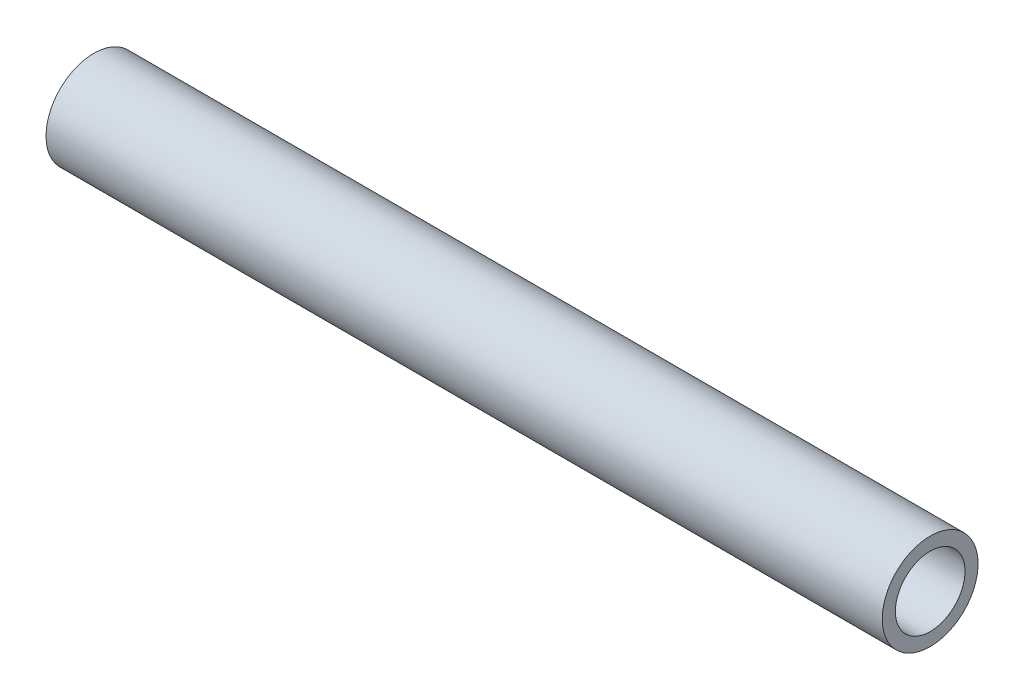
ISO-10303-21;
HEADER;
FILE_DESCRIPTION(('STEP AP214'),'2;1');
FILE_NAME('part.step','',(''),(''),'','','');
FILE_SCHEMA(('AUTOMOTIVE_DESIGN { 1 0 10303 214 1 1 1 1 }'));
ENDSEC;
DATA;
#1=APPLICATION_CONTEXT('core data for automotive mechanical design processes');
#2=APPLICATION_PROTOCOL_DEFINITION('international standard','automotive_design',2000,#1);
#3=PRODUCT_CONTEXT('',#1,'mechanical');
#4=PRODUCT('Part','Part','',(#3));
#5=PRODUCT_RELATED_PRODUCT_CATEGORY('part','',(#4));
#6=PRODUCT_DEFINITION_FORMATION('','',#4);
#7=PRODUCT_DEFINITION_CONTEXT('part definition',#1,'design');
#8=PRODUCT_DEFINITION('design','',#6,#7);
#9=PRODUCT_DEFINITION_SHAPE('','',#8);
#10=(LENGTH_UNIT() NAMED_UNIT(*) SI_UNIT(.MILLI.,.METRE.));
#11=(NAMED_UNIT(*) PLANE_ANGLE_UNIT() SI_UNIT($,.RADIAN.));
#12=(NAMED_UNIT(*) SI_UNIT($,.STERADIAN.) SOLID_ANGLE_UNIT());
#13=UNCERTAINTY_MEASURE_WITH_UNIT(LENGTH_MEASURE(1.E-05),#10,'distance_accuracy_value','');
#14=(GEOMETRIC_REPRESENTATION_CONTEXT(3) GLOBAL_UNCERTAINTY_ASSIGNED_CONTEXT((#13)) GLOBAL_UNIT_ASSIGNED_CONTEXT((#10,
#11,#12)) REPRESENTATION_CONTEXT('',''));
#15=CARTESIAN_POINT('',(0.,0.,0.));
#16=DIRECTION('',(0.,0.,1.));
#17=DIRECTION('',(1.,0.,0.));
#18=AXIS2_PLACEMENT_3D('',#15,#16,#17);
#19=CARTESIAN_POINT('',(152.4,0.,0.));
#20=DIRECTION('',(1.,0.,0.));
#21=DIRECTION('',(0.,0.,-1.));
#22=AXIS2_PLACEMENT_3D('',#19,#20,#21);
#23=PLANE('',#22);
#24=CARTESIAN_POINT('',(152.4,0.,0.));
#25=DIRECTION('',(1.,0.,0.));
#26=DIRECTION('',(0.,0.,-1.));
#27=AXIS2_PLACEMENT_3D('',#24,#25,#26);
#28=CIRCLE('',#27,17.4625);
#29=CARTESIAN_POINT('',(152.4,0.,17.4625));
#30=VERTEX_POINT('',#29);
#31=EDGE_CURVE('E10',#30,#30,#28,.T.);
#32=ORIENTED_EDGE('',*,*,#31,.T.);
#33=EDGE_LOOP('',(#32));
#34=FACE_BOUND('',#33,.T.);
#35=CARTESIAN_POINT('',(152.4,0.,0.));
#36=DIRECTION('',(1.,0.,0.));
#37=DIRECTION('',(0.,0.,-1.));
#38=AXIS2_PLACEMENT_3D('',#35,#36,#37);
#39=CIRCLE('',#38,12.7);
#40=CARTESIAN_POINT('',(152.4,0.,12.7));
#41=VERTEX_POINT('',#40);
#42=EDGE_CURVE('E43',#41,#41,#39,.T.);
#43=ORIENTED_EDGE('',*,*,#42,.F.);
#44=EDGE_LOOP('',(#43));
#45=FACE_BOUND('',#44,.T.);
#46=ADVANCED_FACE('F32',(#34,#45),#23,.T.);
#47=CARTESIAN_POINT('',(-152.4,0.,0.));
#48=DIRECTION('',(1.,0.,0.));
#49=DIRECTION('',(0.,0.,-1.));
#50=AXIS2_PLACEMENT_3D('',#47,#48,#49);
#51=PLANE('',#50);
#52=CARTESIAN_POINT('',(-152.4,0.,0.));
#53=DIRECTION('',(1.,0.,0.));
#54=DIRECTION('',(0.,0.,-1.));
#55=AXIS2_PLACEMENT_3D('',#52,#53,#54);
#56=CIRCLE('',#55,17.4625);
#57=CARTESIAN_POINT('',(-152.4,0.,17.4625));
#58=VERTEX_POINT('',#57);
#59=EDGE_CURVE('E36',#58,#58,#56,.T.);
#60=ORIENTED_EDGE('',*,*,#59,.F.);
#61=EDGE_LOOP('',(#60));
#62=FACE_BOUND('',#61,.T.);
#63=CARTESIAN_POINT('',(-152.4,0.,0.));
#64=DIRECTION('',(1.,0.,0.));
#65=DIRECTION('',(0.,0.,-1.));
#66=AXIS2_PLACEMENT_3D('',#63,#64,#65);
#67=CIRCLE('',#66,12.7);
#68=CARTESIAN_POINT('',(-152.4,0.,12.7));
#69=VERTEX_POINT('',#68);
#70=EDGE_CURVE('E45',#69,#69,#67,.T.);
#71=ORIENTED_EDGE('',*,*,#70,.T.);
#72=EDGE_LOOP('',(#71));
#73=FACE_BOUND('',#72,.T.);
#74=ADVANCED_FACE('F55',(#62,#73),#51,.F.);
#75=CARTESIAN_POINT('',(152.4,0.,0.));
#76=DIRECTION('',(-1.,0.,0.));
#77=DIRECTION('',(0.,0.,1.));
#78=AXIS2_PLACEMENT_3D('',#75,#76,#77);
#79=CYLINDRICAL_SURFACE('',#78,17.4625);
#80=CARTESIAN_POINT('',(152.4,0.,17.4625));
#81=CARTESIAN_POINT('',(149.225,0.,17.4625));
#82=CARTESIAN_POINT('',(146.05,0.,17.4625));
#83=CARTESIAN_POINT('',(139.7,0.,17.4625));
#84=CARTESIAN_POINT('',(136.525,0.,17.4625));
#85=CARTESIAN_POINT('',(130.175,0.,17.4625));
#86=CARTESIAN_POINT('',(127.,0.,17.4625));
#87=CARTESIAN_POINT('',(120.65,0.,17.4625));
#88=CARTESIAN_POINT('',(117.475,0.,17.4625));
#89=CARTESIAN_POINT('',(111.125,0.,17.4625));
#90=CARTESIAN_POINT('',(107.95,0.,17.4625));
#91=CARTESIAN_POINT('',(101.6,0.,17.4625));
#92=CARTESIAN_POINT('',(98.425,0.,17.4625));
#93=CARTESIAN_POINT('',(92.075,0.,17.4625));
#94=CARTESIAN_POINT('',(88.9,0.,17.4625));
#95=CARTESIAN_POINT('',(82.55,0.,17.4625));
#96=CARTESIAN_POINT('',(79.375,0.,17.4625));
#97=CARTESIAN_POINT('',(73.025,0.,17.4625));
#98=CARTESIAN_POINT('',(69.85,0.,17.4625));
#99=CARTESIAN_POINT('',(63.5,0.,17.4625));
#100=CARTESIAN_POINT('',(60.325,0.,17.4625));
#101=CARTESIAN_POINT('',(53.975,0.,17.4625));
#102=CARTESIAN_POINT('',(50.8,0.,17.4625));
#103=CARTESIAN_POINT('',(44.45,0.,17.4625));
#104=CARTESIAN_POINT('',(41.275,0.,17.4625));
#105=CARTESIAN_POINT('',(34.925,0.,17.4625));
#106=CARTESIAN_POINT('',(31.75,0.,17.4625));
#107=CARTESIAN_POINT('',(25.4,0.,17.4625));
#108=CARTESIAN_POINT('',(22.225,0.,17.4625));
#109=CARTESIAN_POINT('',(15.875,0.,17.4625));
#110=CARTESIAN_POINT('',(12.7,0.,17.4625));
#111=CARTESIAN_POINT('',(6.35,0.,17.4625));
#112=CARTESIAN_POINT('',(3.175,0.,17.4625));
#113=CARTESIAN_POINT('',(-3.175,0.,17.4625));
#114=CARTESIAN_POINT('',(-6.35,0.,17.4625));
#115=CARTESIAN_POINT('',(-12.7,0.,17.4625));
#116=CARTESIAN_POINT('',(-15.875,0.,17.4625));
#117=CARTESIAN_POINT('',(-22.225,0.,17.4625));
#118=CARTESIAN_POINT('',(-25.4,0.,17.4625));
#119=CARTESIAN_POINT('',(-31.75,0.,17.4625));
#120=CARTESIAN_POINT('',(-34.925,0.,17.4625));
#121=CARTESIAN_POINT('',(-41.275,0.,17.4625));
#122=CARTESIAN_POINT('',(-44.45,0.,17.4625));
#123=CARTESIAN_POINT('',(-50.8,0.,17.4625));
#124=CARTESIAN_POINT('',(-53.975,0.,17.4625));
#125=CARTESIAN_POINT('',(-60.325,0.,17.4625));
#126=CARTESIAN_POINT('',(-63.5,0.,17.4625));
#127=CARTESIAN_POINT('',(-69.85,0.,17.4625));
#128=CARTESIAN_POINT('',(-73.025,0.,17.4625));
#129=CARTESIAN_POINT('',(-79.375,0.,17.4625));
#130=CARTESIAN_POINT('',(-82.55,0.,17.4625));
#131=CARTESIAN_POINT('',(-88.9,0.,17.4625));
#132=CARTESIAN_POINT('',(-92.075,0.,17.4625));
#133=CARTESIAN_POINT('',(-98.425,0.,17.4625));
#134=CARTESIAN_POINT('',(-101.6,0.,17.4625));
#135=CARTESIAN_POINT('',(-107.95,0.,17.4625));
#136=CARTESIAN_POINT('',(-111.125,0.,17.4625));
#137=CARTESIAN_POINT('',(-117.475,0.,17.4625));
#138=CARTESIAN_POINT('',(-120.65,0.,17.4625));
#139=CARTESIAN_POINT('',(-127.,0.,17.4625));
#140=CARTESIAN_POINT('',(-130.175,0.,17.4625));
#141=CARTESIAN_POINT('',(-136.525,0.,17.4625));
#142=CARTESIAN_POINT('',(-139.7,0.,17.4625));
#143=CARTESIAN_POINT('',(-146.05,0.,17.4625));
#144=CARTESIAN_POINT('',(-149.225,0.,17.4625));
#145=CARTESIAN_POINT('',(-152.4,0.,17.4625));
#146=B_SPLINE_CURVE_WITH_KNOTS('',3,(#80,#81,#82,#83,#84,#85,#86,#87,#88,#89,#90,#91,#92,#93,
#94,#95,#96,#97,#98,#99,#100,#101,#102,#103,#104,#105,#106,#107,#108,#109,#110,#111,#112,#113,
#114,#115,#116,#117,#118,#119,#120,#121,#122,#123,#124,#125,#126,#127,#128,#129,#130,#131,#132,
#133,#134,#135,#136,#137,#138,#139,#140,#141,#142,#143,#144,#145),.UNSPECIFIED.,.F.,.F.,(4,2,2,
2,2,2,2,2,2,2,2,2,2,2,2,2,2,2,2,2,2,2,2,2,2,2,2,2,2,2,2,2,4),(0.,9.52500000000001,19.05,28.575,
38.1,47.625,57.15,66.675,76.2,85.725,95.25,104.775,114.3,123.825,133.35,142.875,152.4,161.925,
171.45,180.975,190.5,200.025,209.55,219.075,228.6,238.125,247.65,257.175,266.7,276.225,285.75,
295.275,304.8),.UNSPECIFIED.);
#147=EDGE_CURVE('BSEAM34',#30,#58,#146,.T.);
#148=ORIENTED_EDGE('',*,*,#31,.F.);
#149=ORIENTED_EDGE('',*,*,#59,.T.);
#150=ORIENTED_EDGE('',*,*,#147,.T.);
#151=ORIENTED_EDGE('',*,*,#147,.F.);
#152=EDGE_LOOP('',(#148,#150,#149,#151));
#153=FACE_BOUND('',#152,.T.);
#154=ADVANCED_FACE('F34',(#153),#79,.T.);
#155=CARTESIAN_POINT('',(152.4,0.,0.));
#156=DIRECTION('',(-1.,0.,0.));
#157=DIRECTION('',(0.,0.,1.));
#158=AXIS2_PLACEMENT_3D('',#155,#156,#157);
#159=CYLINDRICAL_SURFACE('',#158,12.7);
#160=CARTESIAN_POINT('',(152.4,0.,12.7));
#161=CARTESIAN_POINT('',(149.225,0.,12.7));
#162=CARTESIAN_POINT('',(146.05,0.,12.7));
#163=CARTESIAN_POINT('',(139.7,0.,12.7));
#164=CARTESIAN_POINT('',(136.525,0.,12.7));
#165=CARTESIAN_POINT('',(130.175,0.,12.7));
#166=CARTESIAN_POINT('',(127.,0.,12.7));
#167=CARTESIAN_POINT('',(120.65,0.,12.7));
#168=CARTESIAN_POINT('',(117.475,0.,12.7));
#169=CARTESIAN_POINT('',(111.125,0.,12.7));
#170=CARTESIAN_POINT('',(107.95,0.,12.7));
#171=CARTESIAN_POINT('',(101.6,0.,12.7));
#172=CARTESIAN_POINT('',(98.425,0.,12.7));
#173=CARTESIAN_POINT('',(92.075,0.,12.7));
#174=CARTESIAN_POINT('',(88.9,0.,12.7));
#175=CARTESIAN_POINT('',(82.55,0.,12.7));
#176=CARTESIAN_POINT('',(79.375,0.,12.7));
#177=CARTESIAN_POINT('',(73.025,0.,12.7));
#178=CARTESIAN_POINT('',(69.85,0.,12.7));
#179=CARTESIAN_POINT('',(63.5,0.,12.7));
#180=CARTESIAN_POINT('',(60.325,0.,12.7));
#181=CARTESIAN_POINT('',(53.975,0.,12.7));
#182=CARTESIAN_POINT('',(50.8,0.,12.7));
#183=CARTESIAN_POINT('',(44.45,0.,12.7));
#184=CARTESIAN_POINT('',(41.275,0.,12.7));
#185=CARTESIAN_POINT('',(34.925,0.,12.7));
#186=CARTESIAN_POINT('',(31.75,0.,12.7));
#187=CARTESIAN_POINT('',(25.4,0.,12.7));
#188=CARTESIAN_POINT('',(22.225,0.,12.7));
#189=CARTESIAN_POINT('',(15.875,0.,12.7));
#190=CARTESIAN_POINT('',(12.7,0.,12.7));
#191=CARTESIAN_POINT('',(6.35,0.,12.7));
#192=CARTESIAN_POINT('',(3.175,0.,12.7));
#193=CARTESIAN_POINT('',(-3.175,0.,12.7));
#194=CARTESIAN_POINT('',(-6.35,0.,12.7));
#195=CARTESIAN_POINT('',(-12.7,0.,12.7));
#196=CARTESIAN_POINT('',(-15.875,0.,12.7));
#197=CARTESIAN_POINT('',(-22.225,0.,12.7));
#198=CARTESIAN_POINT('',(-25.4,0.,12.7));
#199=CARTESIAN_POINT('',(-31.75,0.,12.7));
#200=CARTESIAN_POINT('',(-34.925,0.,12.7));
#201=CARTESIAN_POINT('',(-41.275,0.,12.7));
#202=CARTESIAN_POINT('',(-44.45,0.,12.7));
#203=CARTESIAN_POINT('',(-50.8,0.,12.7));
#204=CARTESIAN_POINT('',(-53.975,0.,12.7));
#205=CARTESIAN_POINT('',(-60.325,0.,12.7));
#206=CARTESIAN_POINT('',(-63.5,0.,12.7));
#207=CARTESIAN_POINT('',(-69.85,0.,12.7));
#208=CARTESIAN_POINT('',(-73.025,0.,12.7));
#209=CARTESIAN_POINT('',(-79.375,0.,12.7));
#210=CARTESIAN_POINT('',(-82.55,0.,12.7));
#211=CARTESIAN_POINT('',(-88.9,0.,12.7));
#212=CARTESIAN_POINT('',(-92.075,0.,12.7));
#213=CARTESIAN_POINT('',(-98.425,0.,12.7));
#214=CARTESIAN_POINT('',(-101.6,0.,12.7));
#215=CARTESIAN_POINT('',(-107.95,0.,12.7));
#216=CARTESIAN_POINT('',(-111.125,0.,12.7));
#217=CARTESIAN_POINT('',(-117.475,0.,12.7));
#218=CARTESIAN_POINT('',(-120.65,0.,12.7));
#219=CARTESIAN_POINT('',(-127.,0.,12.7));
#220=CARTESIAN_POINT('',(-130.175,0.,12.7));
#221=CARTESIAN_POINT('',(-136.525,0.,12.7));
#222=CARTESIAN_POINT('',(-139.7,0.,12.7));
#223=CARTESIAN_POINT('',(-146.05,0.,12.7));
#224=CARTESIAN_POINT('',(-149.225,0.,12.7));
#225=CARTESIAN_POINT('',(-152.4,0.,12.7));
#226=B_SPLINE_CURVE_WITH_KNOTS('',3,(#160,#161,#162,#163,#164,#165,#166,#167,#168,#169,#170,
#171,#172,#173,#174,#175,#176,#177,#178,#179,#180,#181,#182,#183,#184,#185,#186,#187,#188,#189,
#190,#191,#192,#193,#194,#195,#196,#197,#198,#199,#200,#201,#202,#203,#204,#205,#206,#207,#208,
#209,#210,#211,#212,#213,#214,#215,#216,#217,#218,#219,#220,#221,#222,#223,#224,#225),
.UNSPECIFIED.,.F.,.F.,(4,2,2,2,2,2,2,2,2,2,2,2,2,2,2,2,2,2,2,2,2,2,2,2,2,2,2,2,2,2,2,2,4),(0.,
9.52500000000001,19.05,28.575,38.1,47.625,57.15,66.675,76.2,85.725,95.25,104.775,114.3,123.825,
133.35,142.875,152.4,161.925,171.45,180.975,190.5,200.025,209.55,219.075,228.6,238.125,247.65,
257.175,266.7,276.225,285.75,295.275,304.8),.UNSPECIFIED.);
#227=EDGE_CURVE('BSEAM51',#41,#69,#226,.T.);
#228=ORIENTED_EDGE('',*,*,#42,.T.);
#229=ORIENTED_EDGE('',*,*,#70,.F.);
#230=ORIENTED_EDGE('',*,*,#227,.T.);
#231=ORIENTED_EDGE('',*,*,#227,.F.);
#232=EDGE_LOOP('',(#228,#230,#229,#231));
#233=FACE_BOUND('',#232,.T.);
#234=ADVANCED_FACE('F51',(#233),#159,.F.);
#235=CLOSED_SHELL('',(#46,#74,#154,#234));
#236=MANIFOLD_SOLID_BREP('B2',#235);
#237=ADVANCED_BREP_SHAPE_REPRESENTATION('',(#18,#236),#14);
#238=SHAPE_DEFINITION_REPRESENTATION(#9,#237);
ENDSEC;
END-ISO-10303-21;
